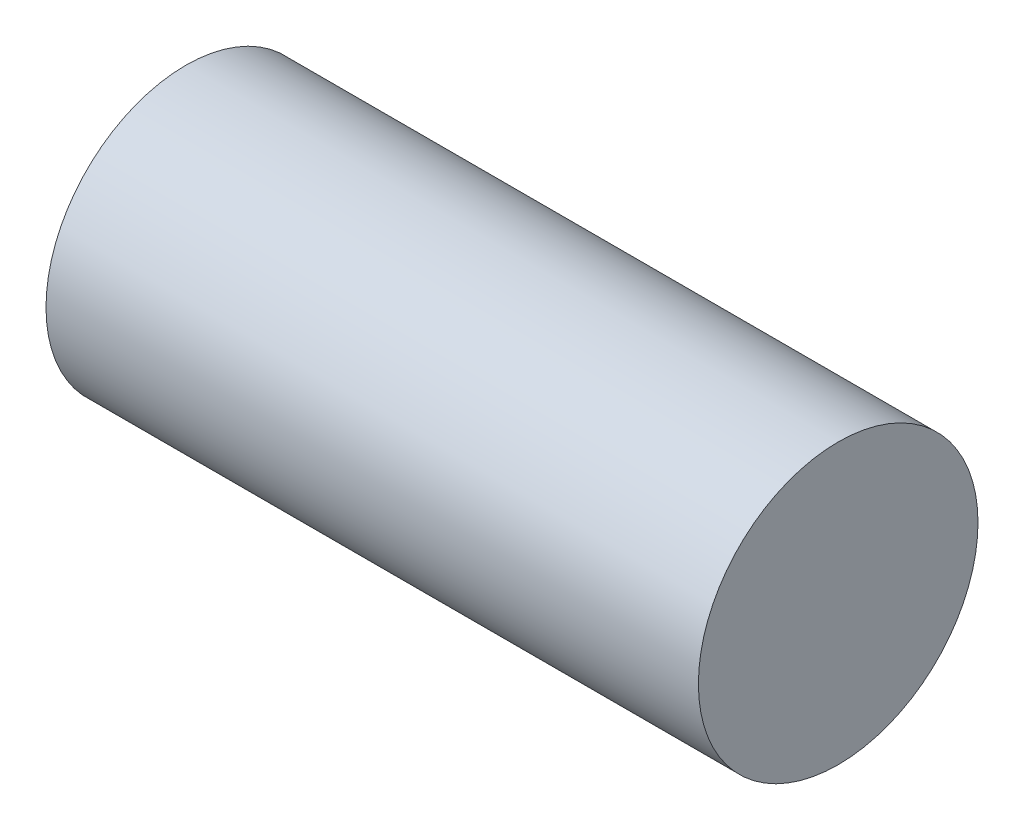
ISO-10303-21;
HEADER;
FILE_DESCRIPTION(('STEP AP214'),'2;1');
FILE_NAME('part.step','',(''),(''),'','','');
FILE_SCHEMA(('AUTOMOTIVE_DESIGN { 1 0 10303 214 1 1 1 1 }'));
ENDSEC;
DATA;
#1=APPLICATION_CONTEXT('core data for automotive mechanical design processes');
#2=APPLICATION_PROTOCOL_DEFINITION('international standard','automotive_design',2000,#1);
#3=PRODUCT_CONTEXT('',#1,'mechanical');
#4=PRODUCT('Part','Part','',(#3));
#5=PRODUCT_RELATED_PRODUCT_CATEGORY('part','',(#4));
#6=PRODUCT_DEFINITION_FORMATION('','',#4);
#7=PRODUCT_DEFINITION_CONTEXT('part definition',#1,'design');
#8=PRODUCT_DEFINITION('design','',#6,#7);
#9=PRODUCT_DEFINITION_SHAPE('','',#8);
#10=(LENGTH_UNIT() NAMED_UNIT(*) SI_UNIT(.MILLI.,.METRE.));
#11=(NAMED_UNIT(*) PLANE_ANGLE_UNIT() SI_UNIT($,.RADIAN.));
#12=(NAMED_UNIT(*) SI_UNIT($,.STERADIAN.) SOLID_ANGLE_UNIT());
#13=UNCERTAINTY_MEASURE_WITH_UNIT(LENGTH_MEASURE(1.E-05),#10,'distance_accuracy_value','');
#14=(GEOMETRIC_REPRESENTATION_CONTEXT(3) GLOBAL_UNCERTAINTY_ASSIGNED_CONTEXT((#13)) GLOBAL_UNIT_ASSIGNED_CONTEXT((#10,
#11,#12)) REPRESENTATION_CONTEXT('',''));
#15=CARTESIAN_POINT('',(0.,0.,0.));
#16=DIRECTION('',(0.,0.,1.));
#17=DIRECTION('',(1.,0.,0.));
#18=AXIS2_PLACEMENT_3D('',#15,#16,#17);
#19=CARTESIAN_POINT('',(70.,0.,0.));
#20=DIRECTION('',(-1.,0.,0.));
#21=DIRECTION('',(0.,0.,1.));
#22=AXIS2_PLACEMENT_3D('',#19,#20,#21);
#23=CYLINDRICAL_SURFACE('',#22,15.);
#24=CARTESIAN_POINT('',(70.,0.,0.));
#25=DIRECTION('',(1.,0.,0.));
#26=DIRECTION('',(0.,0.,-1.));
#27=AXIS2_PLACEMENT_3D('',#24,#25,#26);
#28=CIRCLE('',#27,15.);
#29=CARTESIAN_POINT('',(70.,0.,-15.));
#30=VERTEX_POINT('',#29);
#31=EDGE_CURVE('E10',#30,#30,#28,.T.);
#32=ORIENTED_EDGE('',*,*,#31,.F.);
#33=EDGE_LOOP('',(#32));
#34=FACE_BOUND('',#33,.T.);
#35=CARTESIAN_POINT('',(0.,0.,0.));
#36=DIRECTION('',(1.,0.,0.));
#37=DIRECTION('',(0.,0.,-1.));
#38=AXIS2_PLACEMENT_3D('',#35,#36,#37);
#39=CIRCLE('',#38,15.);
#40=CARTESIAN_POINT('',(0.,0.,-15.));
#41=VERTEX_POINT('',#40);
#42=EDGE_CURVE('E49',#41,#41,#39,.T.);
#43=ORIENTED_EDGE('',*,*,#42,.T.);
#44=EDGE_LOOP('',(#43));
#45=FACE_BOUND('',#44,.T.);
#46=ADVANCED_FACE('F46',(#34,#45),#23,.T.);
#47=CARTESIAN_POINT('',(70.,0.,0.));
#48=DIRECTION('',(1.,0.,0.));
#49=DIRECTION('',(0.,0.,-1.));
#50=AXIS2_PLACEMENT_3D('',#47,#48,#49);
#51=PLANE('',#50);
#52=ORIENTED_EDGE('',*,*,#31,.T.);
#53=EDGE_LOOP('',(#52));
#54=FACE_BOUND('',#53,.T.);
#55=ADVANCED_FACE('F86',(#54),#51,.T.);
#56=CARTESIAN_POINT('',(0.,0.,0.));
#57=DIRECTION('',(1.,0.,0.));
#58=DIRECTION('',(0.,0.,-1.));
#59=AXIS2_PLACEMENT_3D('',#56,#57,#58);
#60=PLANE('',#59);
#61=ORIENTED_EDGE('',*,*,#42,.F.);
#62=EDGE_LOOP('',(#61));
#63=FACE_BOUND('',#62,.T.);
#64=ADVANCED_FACE('F88',(#63),#60,.F.);
#65=CLOSED_SHELL('',(#46,#55,#64));
#66=CARTESIAN_POINT('',(5.,0.,0.));
#67=DIRECTION('',(1.,0.,0.));
#68=DIRECTION('',(0.,0.,-1.));
#69=AXIS2_PLACEMENT_3D('',#66,#67,#68);
#70=CYLINDRICAL_SURFACE('',#69,12.5);
#71=CARTESIAN_POINT('',(5.,0.,0.));
#72=DIRECTION('',(1.,0.,0.));
#73=DIRECTION('',(0.,0.,-1.));
#74=AXIS2_PLACEMENT_3D('',#71,#72,#73);
#75=CIRCLE('',#74,12.5);
#76=CARTESIAN_POINT('',(5.,0.,-12.5));
#77=VERTEX_POINT('',#76);
#78=EDGE_CURVE('E58',#77,#77,#75,.T.);
#79=ORIENTED_EDGE('',*,*,#78,.F.);
#80=EDGE_LOOP('',(#79));
#81=FACE_BOUND('',#80,.T.);
#82=CARTESIAN_POINT('',(65.,0.,0.));
#83=DIRECTION('',(1.,0.,0.));
#84=DIRECTION('',(0.,0.,-1.));
#85=AXIS2_PLACEMENT_3D('',#82,#83,#84);
#86=CIRCLE('',#85,12.5);
#87=CARTESIAN_POINT('',(65.,0.,-12.5));
#88=VERTEX_POINT('',#87);
#89=EDGE_CURVE('E60',#88,#88,#86,.T.);
#90=ORIENTED_EDGE('',*,*,#89,.T.);
#91=EDGE_LOOP('',(#90));
#92=FACE_BOUND('',#91,.T.);
#93=ADVANCED_FACE('F70',(#81,#92),#70,.F.);
#94=CARTESIAN_POINT('',(5.,0.,0.));
#95=DIRECTION('',(1.,0.,0.));
#96=DIRECTION('',(0.,0.,-1.));
#97=AXIS2_PLACEMENT_3D('',#94,#95,#96);
#98=PLANE('',#97);
#99=ORIENTED_EDGE('',*,*,#78,.T.);
#100=EDGE_LOOP('',(#99));
#101=FACE_BOUND('',#100,.T.);
#102=ADVANCED_FACE('F68',(#101),#98,.T.);
#103=CARTESIAN_POINT('',(65.,0.,0.));
#104=DIRECTION('',(1.,0.,0.));
#105=DIRECTION('',(0.,0.,-1.));
#106=AXIS2_PLACEMENT_3D('',#103,#104,#105);
#107=PLANE('',#106);
#108=ORIENTED_EDGE('',*,*,#89,.F.);
#109=EDGE_LOOP('',(#108));
#110=FACE_BOUND('',#109,.T.);
#111=ADVANCED_FACE('F77',(#110),#107,.F.);
#112=CLOSED_SHELL('',(#93,#102,#111));
#113=ORIENTED_CLOSED_SHELL('',*,#112,.T.);
#114=BREP_WITH_VOIDS('B2',#65,(#113));
#115=ADVANCED_BREP_SHAPE_REPRESENTATION('',(#18,#114),#14);
#116=SHAPE_DEFINITION_REPRESENTATION(#9,#115);
ENDSEC;
END-ISO-10303-21;
